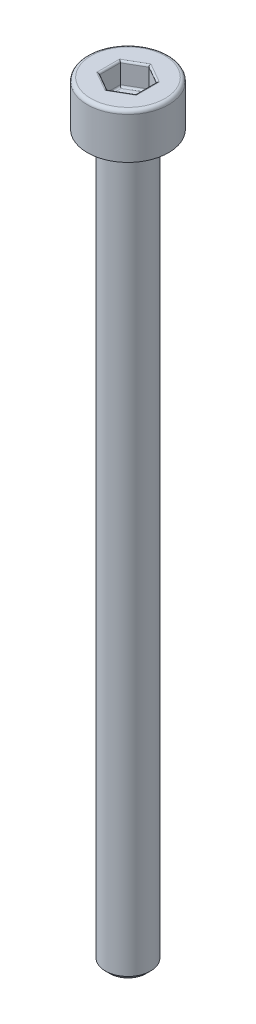
ISO-10303-21;
HEADER;
FILE_DESCRIPTION(('STEP AP214'),'2;1');
FILE_NAME('part.step','',(''),(''),'','','');
FILE_SCHEMA(('AUTOMOTIVE_DESIGN { 1 0 10303 214 1 1 1 1 }'));
ENDSEC;
DATA;
#1=APPLICATION_CONTEXT('core data for automotive mechanical design processes');
#2=APPLICATION_PROTOCOL_DEFINITION('international standard','automotive_design',2000,#1);
#3=PRODUCT_CONTEXT('',#1,'mechanical');
#4=PRODUCT('Part','Part','',(#3));
#5=PRODUCT_RELATED_PRODUCT_CATEGORY('part','',(#4));
#6=PRODUCT_DEFINITION_FORMATION('','',#4);
#7=PRODUCT_DEFINITION_CONTEXT('part definition',#1,'design');
#8=PRODUCT_DEFINITION('design','',#6,#7);
#9=PRODUCT_DEFINITION_SHAPE('','',#8);
#10=(LENGTH_UNIT() NAMED_UNIT(*) SI_UNIT(.MILLI.,.METRE.));
#11=(NAMED_UNIT(*) PLANE_ANGLE_UNIT() SI_UNIT($,.RADIAN.));
#12=(NAMED_UNIT(*) SI_UNIT($,.STERADIAN.) SOLID_ANGLE_UNIT());
#13=UNCERTAINTY_MEASURE_WITH_UNIT(LENGTH_MEASURE(1.E-05),#10,'distance_accuracy_value','');
#14=(GEOMETRIC_REPRESENTATION_CONTEXT(3) GLOBAL_UNCERTAINTY_ASSIGNED_CONTEXT((#13)) GLOBAL_UNIT_ASSIGNED_CONTEXT((#10,
#11,#12)) REPRESENTATION_CONTEXT('',''));
#15=CARTESIAN_POINT('',(0.,0.,0.));
#16=DIRECTION('',(0.,0.,1.));
#17=DIRECTION('',(1.,0.,0.));
#18=AXIS2_PLACEMENT_3D('',#15,#16,#17);
#19=CARTESIAN_POINT('',(0.,-42.5,0.));
#20=DIRECTION('',(0.,-1.,0.));
#21=DIRECTION('',(0.,0.,-1.));
#22=AXIS2_PLACEMENT_3D('',#19,#20,#21);
#23=PLANE('',#22);
#24=CARTESIAN_POINT('',(0.,-42.5,0.));
#25=DIRECTION('',(0.,-1.,0.));
#26=DIRECTION('',(0.,0.,-1.));
#27=AXIS2_PLACEMENT_3D('',#24,#25,#26);
#28=CIRCLE('',#27,0.999999999999994);
#29=CARTESIAN_POINT('',(0.,-42.5,-0.999999999999994));
#30=VERTEX_POINT('',#29);
#31=EDGE_CURVE('E261',#30,#30,#28,.T.);
#32=ORIENTED_EDGE('',*,*,#31,.T.);
#33=EDGE_LOOP('',(#32));
#34=FACE_BOUND('',#33,.T.);
#35=ADVANCED_FACE('F33',(#34),#23,.T.);
#36=CARTESIAN_POINT('',(0.,0.,0.));
#37=DIRECTION('',(0.,1.,0.));
#38=DIRECTION('',(0.,0.,1.));
#39=AXIS2_PLACEMENT_3D('',#36,#37,#38);
#40=CYLINDRICAL_SURFACE('',#39,1.25);
#41=CARTESIAN_POINT('',(0.,-2.75,0.));
#42=DIRECTION('',(0.,-1.,0.));
#43=DIRECTION('',(0.,0.,-1.));
#44=AXIS2_PLACEMENT_3D('',#41,#42,#43);
#45=CIRCLE('',#44,1.25);
#46=CARTESIAN_POINT('',(0.,-2.75,-1.25));
#47=VERTEX_POINT('',#46);
#48=EDGE_CURVE('E258',#47,#47,#45,.T.);
#49=ORIENTED_EDGE('',*,*,#48,.T.);
#50=EDGE_LOOP('',(#49));
#51=FACE_BOUND('',#50,.T.);
#52=CARTESIAN_POINT('',(0.,-42.25,0.));
#53=DIRECTION('',(0.,-1.,0.));
#54=DIRECTION('',(0.,0.,-1.));
#55=AXIS2_PLACEMENT_3D('',#52,#53,#54);
#56=CIRCLE('',#55,1.25);
#57=CARTESIAN_POINT('',(0.,-42.25,-1.25));
#58=VERTEX_POINT('',#57);
#59=EDGE_CURVE('E255',#58,#58,#56,.F.);
#60=ORIENTED_EDGE('',*,*,#59,.T.);
#61=EDGE_LOOP('',(#60));
#62=FACE_BOUND('',#61,.T.);
#63=ADVANCED_FACE('F287',(#51,#62),#40,.T.);
#64=CARTESIAN_POINT('',(-1.25,-2.5,0.));
#65=DIRECTION('',(0.,-1.,0.));
#66=DIRECTION('',(0.,0.,-1.));
#67=AXIS2_PLACEMENT_3D('',#64,#65,#66);
#68=PLANE('',#67);
#69=CARTESIAN_POINT('',(0.,-2.5,0.));
#70=DIRECTION('',(0.,-1.,0.));
#71=DIRECTION('',(0.,0.,-1.));
#72=AXIS2_PLACEMENT_3D('',#69,#70,#71);
#73=CIRCLE('',#72,1.5);
#74=CARTESIAN_POINT('',(0.,-2.5,-1.5));
#75=VERTEX_POINT('',#74);
#76=EDGE_CURVE('E252',#75,#75,#73,.F.);
#77=ORIENTED_EDGE('',*,*,#76,.T.);
#78=EDGE_LOOP('',(#77));
#79=FACE_BOUND('',#78,.T.);
#80=CARTESIAN_POINT('',(0.,-2.5,0.));
#81=DIRECTION('',(0.,1.,0.));
#82=DIRECTION('',(0.,0.,1.));
#83=AXIS2_PLACEMENT_3D('',#80,#81,#82);
#84=CIRCLE('',#83,2.25);
#85=CARTESIAN_POINT('',(0.,-2.5,2.25));
#86=VERTEX_POINT('',#85);
#87=EDGE_CURVE('E249',#86,#86,#84,.T.);
#88=ORIENTED_EDGE('',*,*,#87,.F.);
#89=EDGE_LOOP('',(#88));
#90=FACE_BOUND('',#89,.T.);
#91=ADVANCED_FACE('F293',(#79,#90),#68,.T.);
#92=CARTESIAN_POINT('',(0.,0.,0.));
#93=DIRECTION('',(0.,1.,0.));
#94=DIRECTION('',(0.,0.,1.));
#95=AXIS2_PLACEMENT_3D('',#92,#93,#94);
#96=CYLINDRICAL_SURFACE('',#95,2.25);
#97=CARTESIAN_POINT('',(0.,-0.2,0.));
#98=DIRECTION('',(0.,1.,0.));
#99=DIRECTION('',(0.,0.,1.));
#100=AXIS2_PLACEMENT_3D('',#97,#98,#99);
#101=CIRCLE('',#100,2.25);
#102=CARTESIAN_POINT('',(0.,-0.2,2.25));
#103=VERTEX_POINT('',#102);
#104=EDGE_CURVE('E159',#103,#103,#101,.F.);
#105=ORIENTED_EDGE('',*,*,#104,.T.);
#106=EDGE_LOOP('',(#105));
#107=FACE_BOUND('',#106,.T.);
#108=ORIENTED_EDGE('',*,*,#87,.T.);
#109=EDGE_LOOP('',(#108));
#110=FACE_BOUND('',#109,.T.);
#111=ADVANCED_FACE('F303',(#107,#110),#96,.T.);
#112=CARTESIAN_POINT('',(-2.25,0.,0.));
#113=DIRECTION('',(0.,1.,0.));
#114=DIRECTION('',(0.,0.,1.));
#115=AXIS2_PLACEMENT_3D('',#112,#113,#114);
#116=PLANE('',#115);
#117=DIRECTION('',(0.,0.,1.));
#118=VECTOR('',#117,1.);
#119=CARTESIAN_POINT('',(-1.1,0.,-0.577350269189627));
#120=LINE('',#119,#118);
#121=CARTESIAN_POINT('',(-1.1,0.,0.635085296108588));
#122=VERTEX_POINT('',#121);
#123=CARTESIAN_POINT('',(-1.1,0.,-0.635085296108589));
#124=VERTEX_POINT('',#123);
#125=EDGE_CURVE('E175',#122,#124,#120,.F.);
#126=ORIENTED_EDGE('',*,*,#125,.T.);
#127=DIRECTION('',(-0.866025403784439,0.,0.5));
#128=VECTOR('',#127,1.);
#129=CARTESIAN_POINT('',(-0.0500000000000009,0.,-1.2413030787577));
#130=LINE('',#129,#128);
#131=CARTESIAN_POINT('',(0.,0.,-1.27017059221718));
#132=VERTEX_POINT('',#131);
#133=EDGE_CURVE('E134',#124,#132,#130,.F.);
#134=ORIENTED_EDGE('',*,*,#133,.T.);
#135=DIRECTION('',(-0.866025403784439,0.,-0.5));
#136=VECTOR('',#135,1.);
#137=CARTESIAN_POINT('',(1.05,0.,-0.663952809568071));
#138=LINE('',#137,#136);
#139=CARTESIAN_POINT('',(1.1,0.,-0.63508529610859));
#140=VERTEX_POINT('',#139);
#141=EDGE_CURVE('E161',#132,#140,#138,.F.);
#142=ORIENTED_EDGE('',*,*,#141,.T.);
#143=DIRECTION('',(0.,0.,-1.));
#144=VECTOR('',#143,1.);
#145=CARTESIAN_POINT('',(1.1,0.,0.577350269189625));
#146=LINE('',#145,#144);
#147=CARTESIAN_POINT('',(1.1,0.,0.635085296108588));
#148=VERTEX_POINT('',#147);
#149=EDGE_CURVE('E169',#140,#148,#146,.F.);
#150=ORIENTED_EDGE('',*,*,#149,.T.);
#151=DIRECTION('',(0.866025403784439,0.,-0.5));
#152=VECTOR('',#151,1.);
#153=CARTESIAN_POINT('',(0.0499999999999991,0.,1.24130307875769));
#154=LINE('',#153,#152);
#155=CARTESIAN_POINT('',(0.,0.,1.27017059221718));
#156=VERTEX_POINT('',#155);
#157=EDGE_CURVE('E171',#148,#156,#154,.F.);
#158=ORIENTED_EDGE('',*,*,#157,.T.);
#159=DIRECTION('',(0.866025403784439,0.,0.5));
#160=VECTOR('',#159,1.);
#161=CARTESIAN_POINT('',(-1.05,0.,0.663952809568069));
#162=LINE('',#161,#160);
#163=EDGE_CURVE('E173',#156,#122,#162,.F.);
#164=ORIENTED_EDGE('',*,*,#163,.T.);
#165=EDGE_LOOP('',(#126,#134,#142,#150,#158,#164));
#166=FACE_BOUND('',#165,.T.);
#167=CARTESIAN_POINT('',(0.,0.,0.));
#168=DIRECTION('',(0.,1.,0.));
#169=DIRECTION('',(0.,0.,1.));
#170=AXIS2_PLACEMENT_3D('',#167,#168,#169);
#171=CIRCLE('',#170,2.05);
#172=CARTESIAN_POINT('',(0.,0.,2.05));
#173=VERTEX_POINT('',#172);
#174=EDGE_CURVE('E164',#173,#173,#171,.T.);
#175=ORIENTED_EDGE('',*,*,#174,.T.);
#176=EDGE_LOOP('',(#175));
#177=FACE_BOUND('',#176,.T.);
#178=ADVANCED_FACE('F266',(#166,#177),#116,.T.);
#179=CARTESIAN_POINT('',(0.,-2.5,0.));
#180=DIRECTION('',(0.,1.,0.));
#181=DIRECTION('',(0.,0.,1.));
#182=AXIS2_PLACEMENT_3D('',#179,#180,#181);
#183=CONICAL_SURFACE('',#182,1.5,0.785398163397457);
#184=ORIENTED_EDGE('',*,*,#48,.F.);
#185=EDGE_LOOP('',(#184));
#186=FACE_BOUND('',#185,.T.);
#187=ORIENTED_EDGE('',*,*,#76,.F.);
#188=EDGE_LOOP('',(#187));
#189=FACE_BOUND('',#188,.T.);
#190=ADVANCED_FACE('F281',(#186,#189),#183,.T.);
#191=CARTESIAN_POINT('',(0.,-42.25,0.));
#192=DIRECTION('',(0.,1.,0.));
#193=DIRECTION('',(0.,0.,1.));
#194=AXIS2_PLACEMENT_3D('',#191,#192,#193);
#195=CONICAL_SURFACE('',#194,1.25,0.785398163397438);
#196=ORIENTED_EDGE('',*,*,#31,.F.);
#197=EDGE_LOOP('',(#196));
#198=FACE_BOUND('',#197,.T.);
#199=ORIENTED_EDGE('',*,*,#59,.F.);
#200=EDGE_LOOP('',(#199));
#201=FACE_BOUND('',#200,.T.);
#202=ADVANCED_FACE('F271',(#198,#201),#195,.T.);
#203=CARTESIAN_POINT('',(0.,-0.2,0.));
#204=DIRECTION('',(0.,1.,0.));
#205=DIRECTION('',(0.,0.,1.));
#206=AXIS2_PLACEMENT_3D('',#203,#204,#205);
#207=TOROIDAL_SURFACE('',#206,2.05,0.2);
#208=ORIENTED_EDGE('',*,*,#104,.F.);
#209=EDGE_LOOP('',(#208));
#210=FACE_BOUND('',#209,.T.);
#211=ORIENTED_EDGE('',*,*,#174,.F.);
#212=EDGE_LOOP('',(#211));
#213=FACE_BOUND('',#212,.T.);
#214=ADVANCED_FACE('F268',(#210,#213),#207,.T.);
#215=CARTESIAN_POINT('',(0.999999999999998,-1.25,-0.577350269189627));
#216=DIRECTION('',(0.5,0.,-0.866025403784439));
#217=DIRECTION('',(-0.866025403784439,0.,-0.5));
#218=AXIS2_PLACEMENT_3D('',#215,#216,#217);
#219=PLANE('',#218);
#220=DIRECTION('',(0.,1.,0.));
#221=VECTOR('',#220,1.);
#222=CARTESIAN_POINT('',(0.999999999999998,-1.25,-0.577350269189627));
#223=LINE('',#222,#221);
#224=CARTESIAN_POINT('',(0.999999999999998,-1.15,-0.577350269189627));
#225=VERTEX_POINT('',#224);
#226=CARTESIAN_POINT('',(0.999999999999998,-0.1,-0.577350269189627));
#227=VERTEX_POINT('',#226);
#228=EDGE_CURVE('E243',#225,#227,#223,.T.);
#229=ORIENTED_EDGE('',*,*,#228,.T.);
#230=DIRECTION('',(-0.866025403784439,0.,-0.5));
#231=VECTOR('',#230,1.);
#232=CARTESIAN_POINT('',(0.,-0.1,-1.15470053837925));
#233=LINE('',#232,#231);
#234=CARTESIAN_POINT('',(0.,-0.1,-1.15470053837925));
#235=VERTEX_POINT('',#234);
#236=EDGE_CURVE('E195',#227,#235,#233,.T.);
#237=ORIENTED_EDGE('',*,*,#236,.T.);
#238=DIRECTION('',(0.,1.,0.));
#239=VECTOR('',#238,1.);
#240=CARTESIAN_POINT('',(0.,-1.25,-1.15470053837925));
#241=LINE('',#240,#239);
#242=CARTESIAN_POINT('',(0.,-1.15,-1.15470053837925));
#243=VERTEX_POINT('',#242);
#244=EDGE_CURVE('E145',#243,#235,#241,.T.);
#245=ORIENTED_EDGE('',*,*,#244,.F.);
#246=DIRECTION('',(-0.866025403784439,0.,-0.5));
#247=VECTOR('',#246,1.);
#248=CARTESIAN_POINT('',(0.999999999999998,-1.15,-0.577350269189627));
#249=LINE('',#248,#247);
#250=EDGE_CURVE('E193',#243,#225,#249,.F.);
#251=ORIENTED_EDGE('',*,*,#250,.T.);
#252=EDGE_LOOP('',(#229,#237,#245,#251));
#253=FACE_BOUND('',#252,.T.);
#254=ADVANCED_FACE('F270',(#253),#219,.F.);
#255=CARTESIAN_POINT('',(0.999999999999999,-1.25,0.577350269189625));
#256=DIRECTION('',(1.,0.,0.));
#257=DIRECTION('',(0.,0.,-1.));
#258=AXIS2_PLACEMENT_3D('',#255,#256,#257);
#259=PLANE('',#258);
#260=DIRECTION('',(0.,1.,0.));
#261=VECTOR('',#260,1.);
#262=CARTESIAN_POINT('',(0.999999999999999,-1.25,0.577350269189625));
#263=LINE('',#262,#261);
#264=CARTESIAN_POINT('',(0.999999999999999,-1.15,0.577350269189625));
#265=VERTEX_POINT('',#264);
#266=CARTESIAN_POINT('',(0.999999999999999,-0.1,0.577350269189625));
#267=VERTEX_POINT('',#266);
#268=EDGE_CURVE('E240',#265,#267,#263,.T.);
#269=ORIENTED_EDGE('',*,*,#268,.T.);
#270=DIRECTION('',(0.,0.,-1.));
#271=VECTOR('',#270,1.);
#272=CARTESIAN_POINT('',(0.999999999999998,-0.1,-0.577350269189627));
#273=LINE('',#272,#271);
#274=EDGE_CURVE('E191',#267,#227,#273,.T.);
#275=ORIENTED_EDGE('',*,*,#274,.T.);
#276=ORIENTED_EDGE('',*,*,#228,.F.);
#277=DIRECTION('',(0.,0.,-1.));
#278=VECTOR('',#277,1.);
#279=CARTESIAN_POINT('',(0.999999999999999,-1.15,0.577350269189625));
#280=LINE('',#279,#278);
#281=EDGE_CURVE('E188',#225,#265,#280,.F.);
#282=ORIENTED_EDGE('',*,*,#281,.T.);
#283=EDGE_LOOP('',(#269,#275,#276,#282));
#284=FACE_BOUND('',#283,.T.);
#285=ADVANCED_FACE('F278',(#284),#259,.F.);
#286=CARTESIAN_POINT('',(0.,-1.25,1.15470053837925));
#287=DIRECTION('',(0.5,0.,0.866025403784439));
#288=DIRECTION('',(0.866025403784439,0.,-0.5));
#289=AXIS2_PLACEMENT_3D('',#286,#287,#288);
#290=PLANE('',#289);
#291=DIRECTION('',(0.,1.,0.));
#292=VECTOR('',#291,1.);
#293=CARTESIAN_POINT('',(0.,-1.25,1.15470053837925));
#294=LINE('',#293,#292);
#295=CARTESIAN_POINT('',(0.,-1.15,1.15470053837925));
#296=VERTEX_POINT('',#295);
#297=CARTESIAN_POINT('',(0.,-0.1,1.15470053837925));
#298=VERTEX_POINT('',#297);
#299=EDGE_CURVE('E237',#296,#298,#294,.T.);
#300=ORIENTED_EDGE('',*,*,#299,.T.);
#301=DIRECTION('',(0.866025403784439,0.,-0.5));
#302=VECTOR('',#301,1.);
#303=CARTESIAN_POINT('',(0.999999999999999,-0.1,0.577350269189625));
#304=LINE('',#303,#302);
#305=EDGE_CURVE('E186',#298,#267,#304,.T.);
#306=ORIENTED_EDGE('',*,*,#305,.T.);
#307=ORIENTED_EDGE('',*,*,#268,.F.);
#308=DIRECTION('',(0.866025403784439,0.,-0.5));
#309=VECTOR('',#308,1.);
#310=CARTESIAN_POINT('',(0.,-1.15,1.15470053837925));
#311=LINE('',#310,#309);
#312=EDGE_CURVE('E184',#265,#296,#311,.F.);
#313=ORIENTED_EDGE('',*,*,#312,.T.);
#314=EDGE_LOOP('',(#300,#306,#307,#313));
#315=FACE_BOUND('',#314,.T.);
#316=ADVANCED_FACE('F327',(#315),#290,.F.);
#317=CARTESIAN_POINT('',(-1.,-1.25,0.577350269189625));
#318=DIRECTION('',(-0.5,0.,0.866025403784438));
#319=DIRECTION('',(0.866025403784439,0.,0.5));
#320=AXIS2_PLACEMENT_3D('',#317,#318,#319);
#321=PLANE('',#320);
#322=DIRECTION('',(0.,1.,0.));
#323=VECTOR('',#322,1.);
#324=CARTESIAN_POINT('',(-1.,-1.25,0.577350269189625));
#325=LINE('',#324,#323);
#326=CARTESIAN_POINT('',(-1.,-1.15,0.577350269189625));
#327=VERTEX_POINT('',#326);
#328=CARTESIAN_POINT('',(-1.,-0.1,0.577350269189625));
#329=VERTEX_POINT('',#328);
#330=EDGE_CURVE('E128',#327,#329,#325,.T.);
#331=ORIENTED_EDGE('',*,*,#330,.T.);
#332=DIRECTION('',(0.866025403784439,0.,0.5));
#333=VECTOR('',#332,1.);
#334=CARTESIAN_POINT('',(0.,-0.1,1.15470053837925));
#335=LINE('',#334,#333);
#336=EDGE_CURVE('E182',#329,#298,#335,.T.);
#337=ORIENTED_EDGE('',*,*,#336,.T.);
#338=ORIENTED_EDGE('',*,*,#299,.F.);
#339=DIRECTION('',(0.866025403784439,0.,0.5));
#340=VECTOR('',#339,1.);
#341=CARTESIAN_POINT('',(-1.,-1.15,0.577350269189625));
#342=LINE('',#341,#340);
#343=EDGE_CURVE('E180',#296,#327,#342,.F.);
#344=ORIENTED_EDGE('',*,*,#343,.T.);
#345=EDGE_LOOP('',(#331,#337,#338,#344));
#346=FACE_BOUND('',#345,.T.);
#347=ADVANCED_FACE('F234',(#346),#321,.F.);
#348=CARTESIAN_POINT('',(-1.,-1.25,-0.577350269189627));
#349=DIRECTION('',(-1.,0.,0.));
#350=DIRECTION('',(0.,0.,1.));
#351=AXIS2_PLACEMENT_3D('',#348,#349,#350);
#352=PLANE('',#351);
#353=DIRECTION('',(0.,1.,0.));
#354=VECTOR('',#353,1.);
#355=CARTESIAN_POINT('',(-1.,-1.25,-0.577350269189627));
#356=LINE('',#355,#354);
#357=CARTESIAN_POINT('',(-1.,-1.15,-0.577350269189627));
#358=VERTEX_POINT('',#357);
#359=CARTESIAN_POINT('',(-1.,-0.1,-0.577350269189627));
#360=VERTEX_POINT('',#359);
#361=EDGE_CURVE('E126',#358,#360,#356,.T.);
#362=ORIENTED_EDGE('',*,*,#361,.T.);
#363=DIRECTION('',(0.,0.,1.));
#364=VECTOR('',#363,1.);
#365=CARTESIAN_POINT('',(-1.,-0.1,0.577350269189625));
#366=LINE('',#365,#364);
#367=EDGE_CURVE('E133',#360,#329,#366,.T.);
#368=ORIENTED_EDGE('',*,*,#367,.T.);
#369=ORIENTED_EDGE('',*,*,#330,.F.);
#370=DIRECTION('',(0.,0.,1.));
#371=VECTOR('',#370,1.);
#372=CARTESIAN_POINT('',(-1.,-1.15,-0.577350269189627));
#373=LINE('',#372,#371);
#374=EDGE_CURVE('E123',#327,#358,#373,.F.);
#375=ORIENTED_EDGE('',*,*,#374,.T.);
#376=EDGE_LOOP('',(#362,#368,#369,#375));
#377=FACE_BOUND('',#376,.T.);
#378=ADVANCED_FACE('F125',(#377),#352,.F.);
#379=CARTESIAN_POINT('',(0.,-1.25,-1.15470053837925));
#380=DIRECTION('',(-0.5,0.,-0.866025403784438));
#381=DIRECTION('',(-0.866025403784439,0.,0.5));
#382=AXIS2_PLACEMENT_3D('',#379,#380,#381);
#383=PLANE('',#382);
#384=ORIENTED_EDGE('',*,*,#244,.T.);
#385=DIRECTION('',(-0.866025403784439,0.,0.5));
#386=VECTOR('',#385,1.);
#387=CARTESIAN_POINT('',(-1.,-0.1,-0.577350269189626));
#388=LINE('',#387,#386);
#389=EDGE_CURVE('E144',#235,#360,#388,.T.);
#390=ORIENTED_EDGE('',*,*,#389,.T.);
#391=ORIENTED_EDGE('',*,*,#361,.F.);
#392=DIRECTION('',(-0.866025403784439,0.,0.5));
#393=VECTOR('',#392,1.);
#394=CARTESIAN_POINT('',(0.,-1.15,-1.15470053837925));
#395=LINE('',#394,#393);
#396=EDGE_CURVE('E141',#358,#243,#395,.F.);
#397=ORIENTED_EDGE('',*,*,#396,.T.);
#398=EDGE_LOOP('',(#384,#390,#391,#397));
#399=FACE_BOUND('',#398,.T.);
#400=ADVANCED_FACE('F139',(#399),#383,.F.);
#401=CARTESIAN_POINT('',(0.,-1.25,-1.15470053837925));
#402=DIRECTION('',(0.,1.,0.));
#403=DIRECTION('',(0.,0.,1.));
#404=AXIS2_PLACEMENT_3D('',#401,#402,#403);
#405=PLANE('',#404);
#406=DIRECTION('',(0.866025403784439,0.,-0.5));
#407=VECTOR('',#406,1.);
#408=CARTESIAN_POINT('',(0.949999999999999,-1.25,0.490747728811181));
#409=LINE('',#408,#407);
#410=CARTESIAN_POINT('',(0.,-1.25,1.03923048454133));
#411=VERTEX_POINT('',#410);
#412=CARTESIAN_POINT('',(0.899999999999999,-1.25,0.519615242270663));
#413=VERTEX_POINT('',#412);
#414=EDGE_CURVE('E42',#411,#413,#409,.T.);
#415=ORIENTED_EDGE('',*,*,#414,.T.);
#416=DIRECTION('',(0.,0.,-1.));
#417=VECTOR('',#416,1.);
#418=CARTESIAN_POINT('',(0.899999999999998,-1.25,-1.15470053837925));
#419=LINE('',#418,#417);
#420=CARTESIAN_POINT('',(0.899999999999998,-1.25,-0.519615242270664));
#421=VERTEX_POINT('',#420);
#422=EDGE_CURVE('E11',#413,#421,#419,.T.);
#423=ORIENTED_EDGE('',*,*,#422,.T.);
#424=DIRECTION('',(-0.866025403784439,0.,-0.5));
#425=VECTOR('',#424,1.);
#426=CARTESIAN_POINT('',(-0.0500000000000008,-1.25,-1.06809799800081));
#427=LINE('',#426,#425);
#428=CARTESIAN_POINT('',(0.,-1.25,-1.03923048454133));
#429=VERTEX_POINT('',#428);
#430=EDGE_CURVE('E197',#421,#429,#427,.T.);
#431=ORIENTED_EDGE('',*,*,#430,.T.);
#432=DIRECTION('',(-0.866025403784439,0.,0.5));
#433=VECTOR('',#432,1.);
#434=CARTESIAN_POINT('',(0.0499999999999993,-1.25,-1.06809799800081));
#435=LINE('',#434,#433);
#436=CARTESIAN_POINT('',(-0.9,-1.25,-0.519615242270664));
#437=VERTEX_POINT('',#436);
#438=EDGE_CURVE('E199',#429,#437,#435,.T.);
#439=ORIENTED_EDGE('',*,*,#438,.T.);
#440=DIRECTION('',(0.,0.,1.));
#441=VECTOR('',#440,1.);
#442=CARTESIAN_POINT('',(-0.9,-1.25,-1.15470053837925));
#443=LINE('',#442,#441);
#444=CARTESIAN_POINT('',(-0.9,-1.25,0.519615242270662));
#445=VERTEX_POINT('',#444);
#446=EDGE_CURVE('E150',#437,#445,#443,.T.);
#447=ORIENTED_EDGE('',*,*,#446,.T.);
#448=DIRECTION('',(0.866025403784439,0.,0.5));
#449=VECTOR('',#448,1.);
#450=CARTESIAN_POINT('',(-0.950000000000001,-1.25,0.490747728811181));
#451=LINE('',#450,#449);
#452=EDGE_CURVE('E53',#445,#411,#451,.T.);
#453=ORIENTED_EDGE('',*,*,#452,.T.);
#454=EDGE_LOOP('',(#415,#423,#431,#439,#447,#453));
#455=FACE_BOUND('',#454,.T.);
#456=ADVANCED_FACE('F322',(#455),#405,.T.);
#457=CARTESIAN_POINT('',(0.0499999999999991,-0.1,1.24130307875769));
#458=DIRECTION('',(-0.866025403784439,0.,0.5));
#459=DIRECTION('',(0.5,0.,0.866025403784439));
#460=AXIS2_PLACEMENT_3D('',#457,#458,#459);
#461=CYLINDRICAL_SURFACE('',#460,0.1);
#462=CARTESIAN_POINT('',(0.,-0.1,1.27017059221718));
#463=DIRECTION('',(-1.,0.,0.));
#464=DIRECTION('',(0.,0.,-1.));
#465=AXIS2_PLACEMENT_3D('',#462,#463,#464);
#466=ELLIPSE('',#465,0.115470053837925,0.1);
#467=EDGE_CURVE('E214',#156,#298,#466,.T.);
#468=ORIENTED_EDGE('',*,*,#467,.F.);
#469=ORIENTED_EDGE('',*,*,#157,.F.);
#470=CARTESIAN_POINT('',(1.1,-0.1,0.635085296108588));
#471=DIRECTION('',(-0.5,0.,0.866025403784439));
#472=DIRECTION('',(-0.866025403784439,0.,-0.5));
#473=AXIS2_PLACEMENT_3D('',#470,#471,#472);
#474=ELLIPSE('',#473,0.115470053837925,0.1);
#475=EDGE_CURVE('E217',#267,#148,#474,.F.);
#476=ORIENTED_EDGE('',*,*,#475,.F.);
#477=ORIENTED_EDGE('',*,*,#305,.F.);
#478=EDGE_LOOP('',(#468,#469,#476,#477));
#479=FACE_BOUND('',#478,.T.);
#480=ADVANCED_FACE('F334',(#479),#461,.T.);
#481=CARTESIAN_POINT('',(1.1,-0.1,0.577350269189625));
#482=DIRECTION('',(0.,0.,1.));
#483=DIRECTION('',(1.,0.,0.));
#484=AXIS2_PLACEMENT_3D('',#481,#482,#483);
#485=CYLINDRICAL_SURFACE('',#484,0.1);
#486=ORIENTED_EDGE('',*,*,#475,.T.);
#487=ORIENTED_EDGE('',*,*,#149,.F.);
#488=CARTESIAN_POINT('',(1.1,-0.1,-0.63508529610859));
#489=DIRECTION('',(0.5,0.,0.866025403784439));
#490=DIRECTION('',(-0.866025403784439,0.,0.5));
#491=AXIS2_PLACEMENT_3D('',#488,#489,#490);
#492=ELLIPSE('',#491,0.115470053837925,0.1);
#493=EDGE_CURVE('E211',#227,#140,#492,.F.);
#494=ORIENTED_EDGE('',*,*,#493,.F.);
#495=ORIENTED_EDGE('',*,*,#274,.F.);
#496=EDGE_LOOP('',(#486,#487,#494,#495));
#497=FACE_BOUND('',#496,.T.);
#498=ADVANCED_FACE('F338',(#497),#485,.T.);
#499=CARTESIAN_POINT('',(-1.05,-0.1,0.663952809568069));
#500=DIRECTION('',(-0.866025403784439,0.,-0.5));
#501=DIRECTION('',(-0.5,0.,0.866025403784438));
#502=AXIS2_PLACEMENT_3D('',#499,#500,#501);
#503=CYLINDRICAL_SURFACE('',#502,0.1);
#504=ORIENTED_EDGE('',*,*,#467,.T.);
#505=ORIENTED_EDGE('',*,*,#336,.F.);
#506=CARTESIAN_POINT('',(-1.1,-0.1,0.635085296108587));
#507=DIRECTION('',(-0.5,0.,-0.866025403784439));
#508=DIRECTION('',(0.866025403784439,0.,-0.5));
#509=AXIS2_PLACEMENT_3D('',#506,#507,#508);
#510=ELLIPSE('',#509,0.115470053837925,0.1);
#511=EDGE_CURVE('E208',#122,#329,#510,.T.);
#512=ORIENTED_EDGE('',*,*,#511,.F.);
#513=ORIENTED_EDGE('',*,*,#163,.F.);
#514=EDGE_LOOP('',(#504,#505,#512,#513));
#515=FACE_BOUND('',#514,.T.);
#516=ADVANCED_FACE('F344',(#515),#503,.T.);
#517=CARTESIAN_POINT('',(1.05,-0.1,-0.663952809568071));
#518=DIRECTION('',(0.866025403784439,0.,0.5));
#519=DIRECTION('',(0.5,0.,-0.866025403784439));
#520=AXIS2_PLACEMENT_3D('',#517,#518,#519);
#521=CYLINDRICAL_SURFACE('',#520,0.1);
#522=ORIENTED_EDGE('',*,*,#493,.T.);
#523=ORIENTED_EDGE('',*,*,#141,.F.);
#524=CARTESIAN_POINT('',(0.,-0.1,-1.27017059221718));
#525=DIRECTION('',(1.,0.,0.));
#526=DIRECTION('',(0.,0.,-1.));
#527=AXIS2_PLACEMENT_3D('',#524,#525,#526);
#528=ELLIPSE('',#527,0.115470053837925,0.1);
#529=EDGE_CURVE('E206',#235,#132,#528,.F.);
#530=ORIENTED_EDGE('',*,*,#529,.F.);
#531=ORIENTED_EDGE('',*,*,#236,.F.);
#532=EDGE_LOOP('',(#522,#523,#530,#531));
#533=FACE_BOUND('',#532,.T.);
#534=ADVANCED_FACE('F374',(#533),#521,.T.);
#535=CARTESIAN_POINT('',(-1.1,-0.1,-0.577350269189627));
#536=DIRECTION('',(0.,0.,-1.));
#537=DIRECTION('',(-1.,0.,0.));
#538=AXIS2_PLACEMENT_3D('',#535,#536,#537);
#539=CYLINDRICAL_SURFACE('',#538,0.1);
#540=ORIENTED_EDGE('',*,*,#511,.T.);
#541=ORIENTED_EDGE('',*,*,#367,.F.);
#542=CARTESIAN_POINT('',(-1.1,-0.1,-0.635085296108589));
#543=DIRECTION('',(0.5,0.,-0.866025403784439));
#544=DIRECTION('',(0.866025403784439,0.,0.5));
#545=AXIS2_PLACEMENT_3D('',#542,#543,#544);
#546=ELLIPSE('',#545,0.115470053837925,0.1);
#547=EDGE_CURVE('E204',#124,#360,#546,.T.);
#548=ORIENTED_EDGE('',*,*,#547,.F.);
#549=ORIENTED_EDGE('',*,*,#125,.F.);
#550=EDGE_LOOP('',(#540,#541,#548,#549));
#551=FACE_BOUND('',#550,.T.);
#552=ADVANCED_FACE('F369',(#551),#539,.T.);
#553=CARTESIAN_POINT('',(-0.0500000000000009,-0.1,-1.2413030787577));
#554=DIRECTION('',(0.866025403784439,0.,-0.5));
#555=DIRECTION('',(-0.5,0.,-0.866025403784438));
#556=AXIS2_PLACEMENT_3D('',#553,#554,#555);
#557=CYLINDRICAL_SURFACE('',#556,0.1);
#558=ORIENTED_EDGE('',*,*,#529,.T.);
#559=ORIENTED_EDGE('',*,*,#133,.F.);
#560=ORIENTED_EDGE('',*,*,#547,.T.);
#561=ORIENTED_EDGE('',*,*,#389,.F.);
#562=EDGE_LOOP('',(#558,#559,#560,#561));
#563=FACE_BOUND('',#562,.T.);
#564=ADVANCED_FACE('F365',(#563),#557,.T.);
#565=CARTESIAN_POINT('',(-0.9,-1.15,-1.15470053837925));
#566=DIRECTION('',(0.,0.,1.));
#567=DIRECTION('',(1.,0.,0.));
#568=AXIS2_PLACEMENT_3D('',#565,#566,#567);
#569=CYLINDRICAL_SURFACE('',#568,0.1);
#570=CARTESIAN_POINT('',(-0.900000000000001,-1.15,-0.519615242270664));
#571=DIRECTION('',(-0.5,0.,0.866025403784439));
#572=DIRECTION('',(0.866025403784439,0.,0.5));
#573=AXIS2_PLACEMENT_3D('',#570,#571,#572);
#574=ELLIPSE('',#573,0.115470053837925,0.1);
#575=EDGE_CURVE('E149',#358,#437,#574,.T.);
#576=ORIENTED_EDGE('',*,*,#575,.F.);
#577=ORIENTED_EDGE('',*,*,#374,.F.);
#578=CARTESIAN_POINT('',(-0.9,-1.15,0.519615242270662));
#579=DIRECTION('',(0.5,0.,0.866025403784439));
#580=DIRECTION('',(0.866025403784439,0.,-0.5));
#581=AXIS2_PLACEMENT_3D('',#578,#579,#580);
#582=ELLIPSE('',#581,0.115470053837925,0.1);
#583=EDGE_CURVE('E37',#445,#327,#582,.F.);
#584=ORIENTED_EDGE('',*,*,#583,.F.);
#585=ORIENTED_EDGE('',*,*,#446,.F.);
#586=EDGE_LOOP('',(#576,#577,#584,#585));
#587=FACE_BOUND('',#586,.T.);
#588=ADVANCED_FACE('F35',(#587),#569,.F.);
#589=CARTESIAN_POINT('',(-0.950000000000001,-1.15,0.490747728811181));
#590=DIRECTION('',(0.866025403784439,0.,0.5));
#591=DIRECTION('',(0.5,0.,-0.866025403784438));
#592=AXIS2_PLACEMENT_3D('',#589,#590,#591);
#593=CYLINDRICAL_SURFACE('',#592,0.1);
#594=ORIENTED_EDGE('',*,*,#583,.T.);
#595=ORIENTED_EDGE('',*,*,#343,.F.);
#596=CARTESIAN_POINT('',(0.,-1.15,1.03923048454133));
#597=DIRECTION('',(1.,0.,0.));
#598=DIRECTION('',(0.,0.,-1.));
#599=AXIS2_PLACEMENT_3D('',#596,#597,#598);
#600=ELLIPSE('',#599,0.115470053837925,0.1);
#601=EDGE_CURVE('E153',#411,#296,#600,.F.);
#602=ORIENTED_EDGE('',*,*,#601,.F.);
#603=ORIENTED_EDGE('',*,*,#452,.F.);
#604=EDGE_LOOP('',(#594,#595,#602,#603));
#605=FACE_BOUND('',#604,.T.);
#606=ADVANCED_FACE('F231',(#605),#593,.F.);
#607=CARTESIAN_POINT('',(0.0499999999999993,-1.15,-1.06809799800081));
#608=DIRECTION('',(-0.866025403784439,0.,0.5));
#609=DIRECTION('',(0.5,0.,0.866025403784438));
#610=AXIS2_PLACEMENT_3D('',#607,#608,#609);
#611=CYLINDRICAL_SURFACE('',#610,0.1);
#612=ORIENTED_EDGE('',*,*,#575,.T.);
#613=ORIENTED_EDGE('',*,*,#438,.F.);
#614=CARTESIAN_POINT('',(0.,-1.15,-1.03923048454133));
#615=DIRECTION('',(-1.,0.,0.));
#616=DIRECTION('',(0.,0.,1.));
#617=AXIS2_PLACEMENT_3D('',#614,#615,#616);
#618=ELLIPSE('',#617,0.115470053837925,0.1);
#619=EDGE_CURVE('E157',#243,#429,#618,.T.);
#620=ORIENTED_EDGE('',*,*,#619,.F.);
#621=ORIENTED_EDGE('',*,*,#396,.F.);
#622=EDGE_LOOP('',(#612,#613,#620,#621));
#623=FACE_BOUND('',#622,.T.);
#624=ADVANCED_FACE('F155',(#623),#611,.F.);
#625=CARTESIAN_POINT('',(0.949999999999999,-1.15,0.490747728811181));
#626=DIRECTION('',(0.866025403784439,0.,-0.5));
#627=DIRECTION('',(-0.5,0.,-0.866025403784439));
#628=AXIS2_PLACEMENT_3D('',#625,#626,#627);
#629=CYLINDRICAL_SURFACE('',#628,0.1);
#630=ORIENTED_EDGE('',*,*,#601,.T.);
#631=ORIENTED_EDGE('',*,*,#312,.F.);
#632=CARTESIAN_POINT('',(0.899999999999999,-1.15,0.519615242270662));
#633=DIRECTION('',(0.5,0.,-0.866025403784439));
#634=DIRECTION('',(-0.866025403784439,0.,-0.5));
#635=AXIS2_PLACEMENT_3D('',#632,#633,#634);
#636=ELLIPSE('',#635,0.115470053837925,0.1);
#637=EDGE_CURVE('E222',#413,#265,#636,.F.);
#638=ORIENTED_EDGE('',*,*,#637,.F.);
#639=ORIENTED_EDGE('',*,*,#414,.F.);
#640=EDGE_LOOP('',(#630,#631,#638,#639));
#641=FACE_BOUND('',#640,.T.);
#642=ADVANCED_FACE('F228',(#641),#629,.F.);
#643=CARTESIAN_POINT('',(-0.0500000000000008,-1.15,-1.06809799800081));
#644=DIRECTION('',(-0.866025403784439,0.,-0.5));
#645=DIRECTION('',(-0.5,0.,0.866025403784439));
#646=AXIS2_PLACEMENT_3D('',#643,#644,#645);
#647=CYLINDRICAL_SURFACE('',#646,0.1);
#648=ORIENTED_EDGE('',*,*,#619,.T.);
#649=ORIENTED_EDGE('',*,*,#430,.F.);
#650=CARTESIAN_POINT('',(0.899999999999998,-1.15,-0.519615242270664));
#651=DIRECTION('',(-0.5,0.,-0.866025403784439));
#652=DIRECTION('',(0.866025403784439,0.,-0.5));
#653=AXIS2_PLACEMENT_3D('',#650,#651,#652);
#654=ELLIPSE('',#653,0.115470053837925,0.1);
#655=EDGE_CURVE('E220',#225,#421,#654,.T.);
#656=ORIENTED_EDGE('',*,*,#655,.F.);
#657=ORIENTED_EDGE('',*,*,#250,.F.);
#658=EDGE_LOOP('',(#648,#649,#656,#657));
#659=FACE_BOUND('',#658,.T.);
#660=ADVANCED_FACE('F353',(#659),#647,.F.);
#661=CARTESIAN_POINT('',(0.899999999999998,-1.15,-1.15470053837925));
#662=DIRECTION('',(0.,0.,-1.));
#663=DIRECTION('',(-1.,0.,0.));
#664=AXIS2_PLACEMENT_3D('',#661,#662,#663);
#665=CYLINDRICAL_SURFACE('',#664,0.1);
#666=ORIENTED_EDGE('',*,*,#637,.T.);
#667=ORIENTED_EDGE('',*,*,#281,.F.);
#668=ORIENTED_EDGE('',*,*,#655,.T.);
#669=ORIENTED_EDGE('',*,*,#422,.F.);
#670=EDGE_LOOP('',(#666,#667,#668,#669));
#671=FACE_BOUND('',#670,.T.);
#672=ADVANCED_FACE('F350',(#671),#665,.F.);
#673=CLOSED_SHELL('',(#35,#63,#91,#111,#178,#190,#202,#214,#254,#285,#316,#347,#378,#400,#456,
#480,#498,#516,#534,#552,#564,#588,#606,#624,#642,#660,#672));
#674=MANIFOLD_SOLID_BREP('B2',#673);
#675=ADVANCED_BREP_SHAPE_REPRESENTATION('',(#18,#674),#14);
#676=SHAPE_DEFINITION_REPRESENTATION(#9,#675);
ENDSEC;
END-ISO-10303-21;
